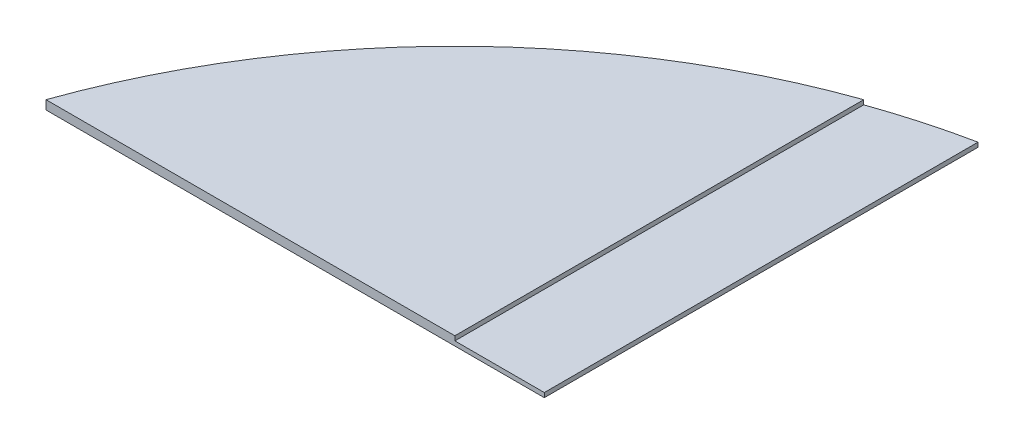
ISO-10303-21;
HEADER;
FILE_DESCRIPTION(('STEP AP214'),'2;1');
FILE_NAME('part.step','',(''),(''),'','','');
FILE_SCHEMA(('AUTOMOTIVE_DESIGN { 1 0 10303 214 1 1 1 1 }'));
ENDSEC;
DATA;
#1=APPLICATION_CONTEXT('core data for automotive mechanical design processes');
#2=APPLICATION_PROTOCOL_DEFINITION('international standard','automotive_design',2000,#1);
#3=PRODUCT_CONTEXT('',#1,'mechanical');
#4=PRODUCT('Part','Part','',(#3));
#5=PRODUCT_RELATED_PRODUCT_CATEGORY('part','',(#4));
#6=PRODUCT_DEFINITION_FORMATION('','',#4);
#7=PRODUCT_DEFINITION_CONTEXT('part definition',#1,'design');
#8=PRODUCT_DEFINITION('design','',#6,#7);
#9=PRODUCT_DEFINITION_SHAPE('','',#8);
#10=(LENGTH_UNIT() NAMED_UNIT(*) SI_UNIT(.MILLI.,.METRE.));
#11=(NAMED_UNIT(*) PLANE_ANGLE_UNIT() SI_UNIT($,.RADIAN.));
#12=(NAMED_UNIT(*) SI_UNIT($,.STERADIAN.) SOLID_ANGLE_UNIT());
#13=UNCERTAINTY_MEASURE_WITH_UNIT(LENGTH_MEASURE(1.E-05),#10,'distance_accuracy_value','');
#14=(GEOMETRIC_REPRESENTATION_CONTEXT(3) GLOBAL_UNCERTAINTY_ASSIGNED_CONTEXT((#13)) GLOBAL_UNIT_ASSIGNED_CONTEXT((#10,
#11,#12)) REPRESENTATION_CONTEXT('',''));
#15=CARTESIAN_POINT('',(0.,0.,0.));
#16=DIRECTION('',(0.,0.,1.));
#17=DIRECTION('',(1.,0.,0.));
#18=AXIS2_PLACEMENT_3D('',#15,#16,#17);
#19=CARTESIAN_POINT('',(-217.292436663422,1.,-88.4846922834953));
#20=DIRECTION('',(0.,1.,0.));
#21=DIRECTION('',(0.,0.,1.));
#22=AXIS2_PLACEMENT_3D('',#19,#20,#21);
#23=PLANE('',#22);
#24=DIRECTION('',(0.,0.,-1.));
#25=VECTOR('',#24,1.);
#26=CARTESIAN_POINT('',(-50.,1.,-50.));
#27=LINE('',#26,#25);
#28=CARTESIAN_POINT('',(-50.,1.,-50.));
#29=VERTEX_POINT('',#28);
#30=CARTESIAN_POINT('',(-50.,1.,-141.42135623731));
#31=VERTEX_POINT('',#30);
#32=EDGE_CURVE('E39',#29,#31,#27,.T.);
#33=ORIENTED_EDGE('',*,*,#32,.F.);
#34=DIRECTION('',(-1.,0.,0.));
#35=VECTOR('',#34,1.);
#36=CARTESIAN_POINT('',(-217.292436663422,1.,-50.));
#37=LINE('',#36,#35);
#38=CARTESIAN_POINT('',(-30.,1.,-50.));
#39=VERTEX_POINT('',#38);
#40=EDGE_CURVE('E89',#39,#29,#37,.T.);
#41=ORIENTED_EDGE('',*,*,#40,.F.);
#42=DIRECTION('',(0.,0.,-1.));
#43=VECTOR('',#42,1.);
#44=CARTESIAN_POINT('',(-30.,1.,-88.4846922834953));
#45=LINE('',#44,#43);
#46=CARTESIAN_POINT('',(-30.,1.,-146.969384566991));
#47=VERTEX_POINT('',#46);
#48=EDGE_CURVE('E59',#39,#47,#45,.T.);
#49=ORIENTED_EDGE('',*,*,#48,.T.);
#50=CARTESIAN_POINT('',(0.,1.,0.));
#51=DIRECTION('',(0.,1.,0.));
#52=DIRECTION('',(0.,0.,1.));
#53=AXIS2_PLACEMENT_3D('',#50,#51,#52);
#54=CIRCLE('',#53,150.);
#55=EDGE_CURVE('E53',#47,#31,#54,.T.);
#56=ORIENTED_EDGE('',*,*,#55,.T.);
#57=EDGE_LOOP('',(#33,#41,#49,#56));
#58=FACE_BOUND('',#57,.T.);
#59=ADVANCED_FACE('F35',(#58),#23,.T.);
#60=CARTESIAN_POINT('',(-217.292436663422,1.,-50.));
#61=DIRECTION('',(0.,0.,1.));
#62=DIRECTION('',(1.,0.,0.));
#63=AXIS2_PLACEMENT_3D('',#60,#61,#62);
#64=PLANE('',#63);
#65=DIRECTION('',(-1.,0.,0.));
#66=VECTOR('',#65,1.);
#67=CARTESIAN_POINT('',(-217.292436663422,0.,-50.));
#68=LINE('',#67,#66);
#69=CARTESIAN_POINT('',(-30.,0.,-50.));
#70=VERTEX_POINT('',#69);
#71=CARTESIAN_POINT('',(-141.42135623731,0.,-50.));
#72=VERTEX_POINT('',#71);
#73=EDGE_CURVE('E79',#70,#72,#68,.T.);
#74=ORIENTED_EDGE('',*,*,#73,.F.);
#75=DIRECTION('',(0.,-1.,0.));
#76=VECTOR('',#75,1.);
#77=CARTESIAN_POINT('',(-30.,1.,-50.));
#78=LINE('',#77,#76);
#79=EDGE_CURVE('E11',#39,#70,#78,.T.);
#80=ORIENTED_EDGE('',*,*,#79,.F.);
#81=ORIENTED_EDGE('',*,*,#40,.T.);
#82=DIRECTION('',(0.,-1.,0.));
#83=VECTOR('',#82,1.);
#84=CARTESIAN_POINT('',(-50.,2.,-50.));
#85=LINE('',#84,#83);
#86=CARTESIAN_POINT('',(-50.,2.,-50.));
#87=VERTEX_POINT('',#86);
#88=EDGE_CURVE('E106',#87,#29,#85,.T.);
#89=ORIENTED_EDGE('',*,*,#88,.F.);
#90=DIRECTION('',(1.,0.,0.));
#91=VECTOR('',#90,1.);
#92=CARTESIAN_POINT('',(-50.,2.,-50.));
#93=LINE('',#92,#91);
#94=CARTESIAN_POINT('',(-141.42135623731,2.,-50.));
#95=VERTEX_POINT('',#94);
#96=EDGE_CURVE('E112',#95,#87,#93,.T.);
#97=ORIENTED_EDGE('',*,*,#96,.F.);
#98=DIRECTION('',(0.,-1.,0.));
#99=VECTOR('',#98,1.);
#100=CARTESIAN_POINT('',(-141.42135623731,2.,-50.));
#101=LINE('',#100,#99);
#102=EDGE_CURVE('E97',#95,#72,#101,.T.);
#103=ORIENTED_EDGE('',*,*,#102,.T.);
#104=EDGE_LOOP('',(#74,#80,#81,#89,#97,#103));
#105=FACE_BOUND('',#104,.T.);
#106=ADVANCED_FACE('F37',(#105),#64,.T.);
#107=CARTESIAN_POINT('',(-30.,1.,-88.4846922834953));
#108=DIRECTION('',(-1.,0.,0.));
#109=DIRECTION('',(0.,0.,1.));
#110=AXIS2_PLACEMENT_3D('',#107,#108,#109);
#111=PLANE('',#110);
#112=DIRECTION('',(0.,0.,-1.));
#113=VECTOR('',#112,1.);
#114=CARTESIAN_POINT('',(-30.,0.,-88.4846922834953));
#115=LINE('',#114,#113);
#116=CARTESIAN_POINT('',(-30.,0.,-146.969384566991));
#117=VERTEX_POINT('',#116);
#118=EDGE_CURVE('E71',#70,#117,#115,.T.);
#119=ORIENTED_EDGE('',*,*,#118,.T.);
#120=DIRECTION('',(0.,-1.,0.));
#121=VECTOR('',#120,1.);
#122=CARTESIAN_POINT('',(-30.,1.,-146.969384566991));
#123=LINE('',#122,#121);
#124=EDGE_CURVE('E45',#47,#117,#123,.T.);
#125=ORIENTED_EDGE('',*,*,#124,.F.);
#126=ORIENTED_EDGE('',*,*,#48,.F.);
#127=ORIENTED_EDGE('',*,*,#79,.T.);
#128=EDGE_LOOP('',(#119,#125,#126,#127));
#129=FACE_BOUND('',#128,.T.);
#130=ADVANCED_FACE('F73',(#129),#111,.F.);
#131=CARTESIAN_POINT('',(0.,1.,0.));
#132=DIRECTION('',(0.,-1.,0.));
#133=DIRECTION('',(0.,0.,-1.));
#134=AXIS2_PLACEMENT_3D('',#131,#132,#133);
#135=CYLINDRICAL_SURFACE('',#134,150.);
#136=CARTESIAN_POINT('',(0.,0.,0.));
#137=DIRECTION('',(0.,1.,0.));
#138=DIRECTION('',(0.,0.,1.));
#139=AXIS2_PLACEMENT_3D('',#136,#137,#138);
#140=CIRCLE('',#139,150.);
#141=EDGE_CURVE('E78',#117,#72,#140,.T.);
#142=ORIENTED_EDGE('',*,*,#141,.T.);
#143=ORIENTED_EDGE('',*,*,#102,.F.);
#144=CARTESIAN_POINT('',(5.68989300120393E-13,2.,5.27355936696949E-13));
#145=DIRECTION('',(0.,1.,0.));
#146=DIRECTION('',(0.,0.,-1.));
#147=AXIS2_PLACEMENT_3D('',#144,#145,#146);
#148=CIRCLE('',#147,150.000000000001);
#149=CARTESIAN_POINT('',(-50.0000000000001,2.,-141.42135623731));
#150=VERTEX_POINT('',#149);
#151=EDGE_CURVE('E119',#150,#95,#148,.T.);
#152=ORIENTED_EDGE('',*,*,#151,.F.);
#153=DIRECTION('',(0.,-1.,0.));
#154=VECTOR('',#153,1.);
#155=CARTESIAN_POINT('',(-50.0000000000001,2.,-141.42135623731));
#156=LINE('',#155,#154);
#157=EDGE_CURVE('E101',#150,#31,#156,.T.);
#158=ORIENTED_EDGE('',*,*,#157,.T.);
#159=ORIENTED_EDGE('',*,*,#55,.F.);
#160=ORIENTED_EDGE('',*,*,#124,.T.);
#161=EDGE_LOOP('',(#142,#143,#152,#158,#159,#160));
#162=FACE_BOUND('',#161,.T.);
#163=ADVANCED_FACE('F83',(#162),#135,.T.);
#164=CARTESIAN_POINT('',(-217.292436663422,0.,-88.4846922834953));
#165=DIRECTION('',(0.,1.,0.));
#166=DIRECTION('',(0.,0.,1.));
#167=AXIS2_PLACEMENT_3D('',#164,#165,#166);
#168=PLANE('',#167);
#169=ORIENTED_EDGE('',*,*,#73,.T.);
#170=ORIENTED_EDGE('',*,*,#141,.F.);
#171=ORIENTED_EDGE('',*,*,#118,.F.);
#172=EDGE_LOOP('',(#169,#170,#171));
#173=FACE_BOUND('',#172,.T.);
#174=ADVANCED_FACE('F87',(#173),#168,.F.);
#175=CARTESIAN_POINT('',(-50.,2.,-50.));
#176=DIRECTION('',(-1.,0.,0.));
#177=DIRECTION('',(0.,0.,1.));
#178=AXIS2_PLACEMENT_3D('',#175,#176,#177);
#179=PLANE('',#178);
#180=ORIENTED_EDGE('',*,*,#32,.T.);
#181=ORIENTED_EDGE('',*,*,#157,.F.);
#182=DIRECTION('',(0.,0.,-1.));
#183=VECTOR('',#182,1.);
#184=CARTESIAN_POINT('',(-50.,2.,-50.));
#185=LINE('',#184,#183);
#186=EDGE_CURVE('E125',#87,#150,#185,.T.);
#187=ORIENTED_EDGE('',*,*,#186,.F.);
#188=ORIENTED_EDGE('',*,*,#88,.T.);
#189=EDGE_LOOP('',(#180,#181,#187,#188));
#190=FACE_BOUND('',#189,.T.);
#191=ADVANCED_FACE('F129',(#190),#179,.F.);
#192=CARTESIAN_POINT('',(5.68989300120393E-13,2.,5.27355936696949E-13));
#193=DIRECTION('',(0.,-1.,0.));
#194=DIRECTION('',(0.,0.,-1.));
#195=AXIS2_PLACEMENT_3D('',#192,#193,#194);
#196=PLANE('',#195);
#197=ORIENTED_EDGE('',*,*,#186,.T.);
#198=ORIENTED_EDGE('',*,*,#151,.T.);
#199=ORIENTED_EDGE('',*,*,#96,.T.);
#200=EDGE_LOOP('',(#197,#198,#199));
#201=FACE_BOUND('',#200,.T.);
#202=ADVANCED_FACE('F135',(#201),#196,.F.);
#203=CLOSED_SHELL('',(#59,#106,#130,#163,#174,#191,#202));
#204=MANIFOLD_SOLID_BREP('B2',#203);
#205=ADVANCED_BREP_SHAPE_REPRESENTATION('',(#18,#204),#14);
#206=SHAPE_DEFINITION_REPRESENTATION(#9,#205);
ENDSEC;
END-ISO-10303-21;
